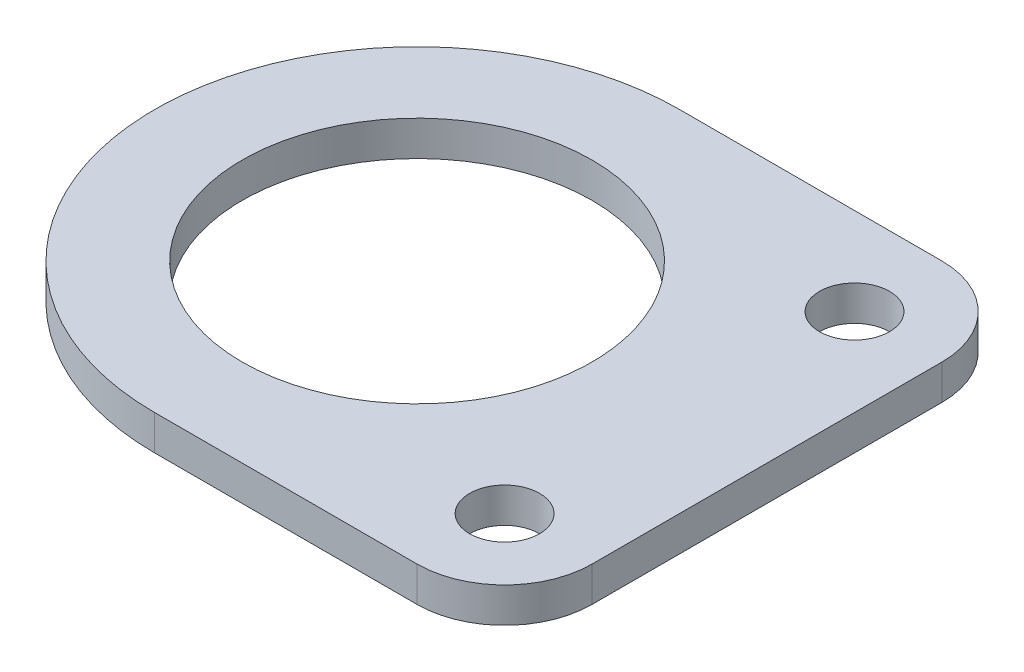
ISO-10303-21;
HEADER;
FILE_DESCRIPTION(('STEP AP214'),'2;1');
FILE_NAME('part.step','',(''),(''),'','','');
FILE_SCHEMA(('AUTOMOTIVE_DESIGN { 1 0 10303 214 1 1 1 1 }'));
ENDSEC;
DATA;
#1=APPLICATION_CONTEXT('core data for automotive mechanical design processes');
#2=APPLICATION_PROTOCOL_DEFINITION('international standard','automotive_design',2000,#1);
#3=PRODUCT_CONTEXT('',#1,'mechanical');
#4=PRODUCT('Part','Part','',(#3));
#5=PRODUCT_RELATED_PRODUCT_CATEGORY('part','',(#4));
#6=PRODUCT_DEFINITION_FORMATION('','',#4);
#7=PRODUCT_DEFINITION_CONTEXT('part definition',#1,'design');
#8=PRODUCT_DEFINITION('design','',#6,#7);
#9=PRODUCT_DEFINITION_SHAPE('','',#8);
#10=(LENGTH_UNIT() NAMED_UNIT(*) SI_UNIT(.MILLI.,.METRE.));
#11=(NAMED_UNIT(*) PLANE_ANGLE_UNIT() SI_UNIT($,.RADIAN.));
#12=(NAMED_UNIT(*) SI_UNIT($,.STERADIAN.) SOLID_ANGLE_UNIT());
#13=UNCERTAINTY_MEASURE_WITH_UNIT(LENGTH_MEASURE(1.E-05),#10,'distance_accuracy_value','');
#14=(GEOMETRIC_REPRESENTATION_CONTEXT(3) GLOBAL_UNCERTAINTY_ASSIGNED_CONTEXT((#13)) GLOBAL_UNIT_ASSIGNED_CONTEXT((#10,
#11,#12)) REPRESENTATION_CONTEXT('',''));
#15=CARTESIAN_POINT('',(0.,0.,0.));
#16=DIRECTION('',(0.,0.,1.));
#17=DIRECTION('',(1.,0.,0.));
#18=AXIS2_PLACEMENT_3D('',#15,#16,#17);
#19=CARTESIAN_POINT('',(0.,45.8673098247866,0.));
#20=DIRECTION('',(0.,1.,0.));
#21=DIRECTION('',(0.,0.,1.));
#22=AXIS2_PLACEMENT_3D('',#19,#20,#21);
#23=CYLINDRICAL_SURFACE('',#22,9.99999999999999);
#24=CARTESIAN_POINT('',(0.,0.,0.));
#25=DIRECTION('',(0.,1.,0.));
#26=DIRECTION('',(0.,0.,1.));
#27=AXIS2_PLACEMENT_3D('',#24,#25,#26);
#28=CIRCLE('',#27,9.99999999999999);
#29=CARTESIAN_POINT('',(0.,0.,9.99999999999999));
#30=VERTEX_POINT('',#29);
#31=EDGE_CURVE('E12',#30,#30,#28,.T.);
#32=ORIENTED_EDGE('',*,*,#31,.F.);
#33=EDGE_LOOP('',(#32));
#34=FACE_BOUND('',#33,.T.);
#35=CARTESIAN_POINT('',(0.,2.00000000000002,0.));
#36=DIRECTION('',(0.,1.,0.));
#37=DIRECTION('',(0.,0.,1.));
#38=AXIS2_PLACEMENT_3D('',#35,#36,#37);
#39=CIRCLE('',#38,9.99999999999999);
#40=CARTESIAN_POINT('',(0.,2.00000000000002,9.99999999999999));
#41=VERTEX_POINT('',#40);
#42=EDGE_CURVE('E178',#41,#41,#39,.T.);
#43=ORIENTED_EDGE('',*,*,#42,.T.);
#44=EDGE_LOOP('',(#43));
#45=FACE_BOUND('',#44,.T.);
#46=ADVANCED_FACE('F44',(#34,#45),#23,.F.);
#47=CARTESIAN_POINT('',(-9.99999999999999,0.,0.));
#48=DIRECTION('',(0.,-1.,0.));
#49=DIRECTION('',(0.,0.,-1.));
#50=AXIS2_PLACEMENT_3D('',#47,#48,#49);
#51=PLANE('',#50);
#52=CARTESIAN_POINT('',(15.,0.,9.99999999999996));
#53=DIRECTION('',(0.,-1.,0.));
#54=DIRECTION('',(0.,0.,-1.));
#55=AXIS2_PLACEMENT_3D('',#52,#53,#54);
#56=CIRCLE('',#55,2.);
#57=CARTESIAN_POINT('',(15.,0.,7.99999999999996));
#58=VERTEX_POINT('',#57);
#59=EDGE_CURVE('E187',#58,#58,#56,.T.);
#60=ORIENTED_EDGE('',*,*,#59,.F.);
#61=EDGE_LOOP('',(#60));
#62=FACE_BOUND('',#61,.T.);
#63=CARTESIAN_POINT('',(15.,0.,-9.99999999999996));
#64=DIRECTION('',(0.,-1.,0.));
#65=DIRECTION('',(0.,0.,-1.));
#66=AXIS2_PLACEMENT_3D('',#63,#64,#65);
#67=CIRCLE('',#66,2.);
#68=CARTESIAN_POINT('',(15.,0.,-12.));
#69=VERTEX_POINT('',#68);
#70=EDGE_CURVE('E179',#69,#69,#67,.T.);
#71=ORIENTED_EDGE('',*,*,#70,.F.);
#72=EDGE_LOOP('',(#71));
#73=FACE_BOUND('',#72,.T.);
#74=ORIENTED_EDGE('',*,*,#31,.T.);
#75=EDGE_LOOP('',(#74));
#76=FACE_BOUND('',#75,.T.);
#77=CARTESIAN_POINT('',(0.,0.,0.));
#78=DIRECTION('',(0.,1.,0.));
#79=DIRECTION('',(0.,0.,1.));
#80=AXIS2_PLACEMENT_3D('',#77,#78,#79);
#81=CIRCLE('',#80,15.);
#82=CARTESIAN_POINT('',(0.,0.,-15.));
#83=VERTEX_POINT('',#82);
#84=CARTESIAN_POINT('',(0.,0.,15.));
#85=VERTEX_POINT('',#84);
#86=EDGE_CURVE('E51',#83,#85,#81,.T.);
#87=ORIENTED_EDGE('',*,*,#86,.F.);
#88=DIRECTION('',(1.,0.,0.));
#89=VECTOR('',#88,1.);
#90=CARTESIAN_POINT('',(0.,0.,-15.));
#91=LINE('',#90,#89);
#92=CARTESIAN_POINT('',(15.,0.,-15.));
#93=VERTEX_POINT('',#92);
#94=EDGE_CURVE('E131',#83,#93,#91,.T.);
#95=ORIENTED_EDGE('',*,*,#94,.T.);
#96=CARTESIAN_POINT('',(15.,0.,-10.));
#97=DIRECTION('',(0.,-1.,0.));
#98=DIRECTION('',(0.,0.,-1.));
#99=AXIS2_PLACEMENT_3D('',#96,#97,#98);
#100=CIRCLE('',#99,5.);
#101=CARTESIAN_POINT('',(20.,0.,-10.));
#102=VERTEX_POINT('',#101);
#103=EDGE_CURVE('E134',#93,#102,#100,.T.);
#104=ORIENTED_EDGE('',*,*,#103,.T.);
#105=DIRECTION('',(0.,0.,1.));
#106=VECTOR('',#105,1.);
#107=CARTESIAN_POINT('',(20.,0.,-10.));
#108=LINE('',#107,#106);
#109=CARTESIAN_POINT('',(20.,0.,10.));
#110=VERTEX_POINT('',#109);
#111=EDGE_CURVE('E138',#102,#110,#108,.T.);
#112=ORIENTED_EDGE('',*,*,#111,.T.);
#113=CARTESIAN_POINT('',(15.,0.,10.));
#114=DIRECTION('',(0.,-1.,0.));
#115=DIRECTION('',(0.,0.,-1.));
#116=AXIS2_PLACEMENT_3D('',#113,#114,#115);
#117=CIRCLE('',#116,5.);
#118=CARTESIAN_POINT('',(15.,0.,15.));
#119=VERTEX_POINT('',#118);
#120=EDGE_CURVE('E110',#110,#119,#117,.T.);
#121=ORIENTED_EDGE('',*,*,#120,.T.);
#122=DIRECTION('',(-1.,0.,0.));
#123=VECTOR('',#122,1.);
#124=CARTESIAN_POINT('',(15.,0.,15.));
#125=LINE('',#124,#123);
#126=EDGE_CURVE('E141',#119,#85,#125,.T.);
#127=ORIENTED_EDGE('',*,*,#126,.T.);
#128=EDGE_LOOP('',(#87,#95,#104,#112,#121,#127));
#129=FACE_BOUND('',#128,.T.);
#130=ADVANCED_FACE('F156',(#62,#73,#76,#129),#51,.T.);
#131=CARTESIAN_POINT('',(0.,45.8673098247866,0.));
#132=DIRECTION('',(0.,1.,0.));
#133=DIRECTION('',(0.,0.,1.));
#134=AXIS2_PLACEMENT_3D('',#131,#132,#133);
#135=CYLINDRICAL_SURFACE('',#134,15.);
#136=DIRECTION('',(0.,-1.,0.));
#137=VECTOR('',#136,1.);
#138=CARTESIAN_POINT('',(0.,2.,15.));
#139=LINE('',#138,#137);
#140=CARTESIAN_POINT('',(0.,2.,15.));
#141=VERTEX_POINT('',#140);
#142=EDGE_CURVE('E90',#141,#85,#139,.T.);
#143=ORIENTED_EDGE('',*,*,#142,.F.);
#144=CARTESIAN_POINT('',(0.,2.00000000000001,0.));
#145=DIRECTION('',(0.,1.,0.));
#146=DIRECTION('',(0.,0.,1.));
#147=AXIS2_PLACEMENT_3D('',#144,#145,#146);
#148=CIRCLE('',#147,15.);
#149=CARTESIAN_POINT('',(0.,2.00000000000001,-15.));
#150=VERTEX_POINT('',#149);
#151=EDGE_CURVE('E144',#150,#141,#148,.T.);
#152=ORIENTED_EDGE('',*,*,#151,.F.);
#153=DIRECTION('',(0.,-1.,0.));
#154=VECTOR('',#153,1.);
#155=CARTESIAN_POINT('',(0.,2.,-15.));
#156=LINE('',#155,#154);
#157=EDGE_CURVE('E130',#150,#83,#156,.T.);
#158=ORIENTED_EDGE('',*,*,#157,.T.);
#159=ORIENTED_EDGE('',*,*,#86,.T.);
#160=EDGE_LOOP('',(#143,#152,#158,#159));
#161=FACE_BOUND('',#160,.T.);
#162=ADVANCED_FACE('F153',(#161),#135,.T.);
#163=CARTESIAN_POINT('',(-15.,2.00000000000001,0.));
#164=DIRECTION('',(0.,1.,0.));
#165=DIRECTION('',(0.,0.,1.));
#166=AXIS2_PLACEMENT_3D('',#163,#164,#165);
#167=PLANE('',#166);
#168=CARTESIAN_POINT('',(15.,2.,9.99999999999996));
#169=DIRECTION('',(0.,-1.,0.));
#170=DIRECTION('',(0.,0.,-1.));
#171=AXIS2_PLACEMENT_3D('',#168,#169,#170);
#172=CIRCLE('',#171,2.);
#173=CARTESIAN_POINT('',(15.,2.,7.99999999999996));
#174=VERTEX_POINT('',#173);
#175=EDGE_CURVE('E135',#174,#174,#172,.T.);
#176=ORIENTED_EDGE('',*,*,#175,.T.);
#177=EDGE_LOOP('',(#176));
#178=FACE_BOUND('',#177,.T.);
#179=CARTESIAN_POINT('',(15.,2.,-9.99999999999996));
#180=DIRECTION('',(0.,-1.,0.));
#181=DIRECTION('',(0.,0.,-1.));
#182=AXIS2_PLACEMENT_3D('',#179,#180,#181);
#183=CIRCLE('',#182,2.);
#184=CARTESIAN_POINT('',(15.,2.,-12.));
#185=VERTEX_POINT('',#184);
#186=EDGE_CURVE('E182',#185,#185,#183,.T.);
#187=ORIENTED_EDGE('',*,*,#186,.T.);
#188=EDGE_LOOP('',(#187));
#189=FACE_BOUND('',#188,.T.);
#190=ORIENTED_EDGE('',*,*,#151,.T.);
#191=DIRECTION('',(-1.,0.,0.));
#192=VECTOR('',#191,1.);
#193=CARTESIAN_POINT('',(15.,2.,15.));
#194=LINE('',#193,#192);
#195=CARTESIAN_POINT('',(15.,2.,15.));
#196=VERTEX_POINT('',#195);
#197=EDGE_CURVE('E67',#196,#141,#194,.T.);
#198=ORIENTED_EDGE('',*,*,#197,.F.);
#199=CARTESIAN_POINT('',(15.,2.,10.));
#200=DIRECTION('',(0.,-1.,0.));
#201=DIRECTION('',(0.,0.,-1.));
#202=AXIS2_PLACEMENT_3D('',#199,#200,#201);
#203=CIRCLE('',#202,5.);
#204=CARTESIAN_POINT('',(20.,2.,10.));
#205=VERTEX_POINT('',#204);
#206=EDGE_CURVE('E108',#205,#196,#203,.T.);
#207=ORIENTED_EDGE('',*,*,#206,.F.);
#208=DIRECTION('',(0.,0.,1.));
#209=VECTOR('',#208,1.);
#210=CARTESIAN_POINT('',(20.,2.,-10.));
#211=LINE('',#210,#209);
#212=CARTESIAN_POINT('',(20.,2.,-10.));
#213=VERTEX_POINT('',#212);
#214=EDGE_CURVE('E121',#213,#205,#211,.T.);
#215=ORIENTED_EDGE('',*,*,#214,.F.);
#216=CARTESIAN_POINT('',(15.,2.,-10.));
#217=DIRECTION('',(0.,-1.,0.));
#218=DIRECTION('',(0.,0.,-1.));
#219=AXIS2_PLACEMENT_3D('',#216,#217,#218);
#220=CIRCLE('',#219,5.);
#221=CARTESIAN_POINT('',(15.,2.,-15.));
#222=VERTEX_POINT('',#221);
#223=EDGE_CURVE('E124',#222,#213,#220,.T.);
#224=ORIENTED_EDGE('',*,*,#223,.F.);
#225=DIRECTION('',(1.,0.,0.));
#226=VECTOR('',#225,1.);
#227=CARTESIAN_POINT('',(0.,2.,-15.));
#228=LINE('',#227,#226);
#229=EDGE_CURVE('E58',#150,#222,#228,.T.);
#230=ORIENTED_EDGE('',*,*,#229,.F.);
#231=EDGE_LOOP('',(#190,#198,#207,#215,#224,#230));
#232=FACE_BOUND('',#231,.T.);
#233=ORIENTED_EDGE('',*,*,#42,.F.);
#234=EDGE_LOOP('',(#233));
#235=FACE_BOUND('',#234,.T.);
#236=ADVANCED_FACE('F119',(#178,#189,#232,#235),#167,.T.);
#237=CARTESIAN_POINT('',(15.,2.,15.));
#238=DIRECTION('',(0.,0.,1.));
#239=DIRECTION('',(1.,0.,0.));
#240=AXIS2_PLACEMENT_3D('',#237,#238,#239);
#241=PLANE('',#240);
#242=ORIENTED_EDGE('',*,*,#126,.F.);
#243=DIRECTION('',(0.,-1.,0.));
#244=VECTOR('',#243,1.);
#245=CARTESIAN_POINT('',(15.,2.,15.));
#246=LINE('',#245,#244);
#247=EDGE_CURVE('E115',#196,#119,#246,.T.);
#248=ORIENTED_EDGE('',*,*,#247,.F.);
#249=ORIENTED_EDGE('',*,*,#197,.T.);
#250=ORIENTED_EDGE('',*,*,#142,.T.);
#251=EDGE_LOOP('',(#242,#248,#249,#250));
#252=FACE_BOUND('',#251,.T.);
#253=ADVANCED_FACE('F157',(#252),#241,.T.);
#254=CARTESIAN_POINT('',(15.,2.,10.));
#255=DIRECTION('',(0.,-1.,0.));
#256=DIRECTION('',(0.,0.,-1.));
#257=AXIS2_PLACEMENT_3D('',#254,#255,#256);
#258=CYLINDRICAL_SURFACE('',#257,5.);
#259=ORIENTED_EDGE('',*,*,#120,.F.);
#260=DIRECTION('',(0.,-1.,0.));
#261=VECTOR('',#260,1.);
#262=CARTESIAN_POINT('',(20.,2.,10.));
#263=LINE('',#262,#261);
#264=EDGE_CURVE('E105',#205,#110,#263,.T.);
#265=ORIENTED_EDGE('',*,*,#264,.F.);
#266=ORIENTED_EDGE('',*,*,#206,.T.);
#267=ORIENTED_EDGE('',*,*,#247,.T.);
#268=EDGE_LOOP('',(#259,#265,#266,#267));
#269=FACE_BOUND('',#268,.T.);
#270=ADVANCED_FACE('F107',(#269),#258,.T.);
#271=CARTESIAN_POINT('',(20.,2.,-10.));
#272=DIRECTION('',(1.,0.,0.));
#273=DIRECTION('',(0.,0.,-1.));
#274=AXIS2_PLACEMENT_3D('',#271,#272,#273);
#275=PLANE('',#274);
#276=ORIENTED_EDGE('',*,*,#111,.F.);
#277=DIRECTION('',(0.,-1.,0.));
#278=VECTOR('',#277,1.);
#279=CARTESIAN_POINT('',(20.,2.,-10.));
#280=LINE('',#279,#278);
#281=EDGE_CURVE('E116',#213,#102,#280,.T.);
#282=ORIENTED_EDGE('',*,*,#281,.F.);
#283=ORIENTED_EDGE('',*,*,#214,.T.);
#284=ORIENTED_EDGE('',*,*,#264,.T.);
#285=EDGE_LOOP('',(#276,#282,#283,#284));
#286=FACE_BOUND('',#285,.T.);
#287=ADVANCED_FACE('F123',(#286),#275,.T.);
#288=CARTESIAN_POINT('',(15.,2.,-10.));
#289=DIRECTION('',(0.,-1.,0.));
#290=DIRECTION('',(0.,0.,-1.));
#291=AXIS2_PLACEMENT_3D('',#288,#289,#290);
#292=CYLINDRICAL_SURFACE('',#291,5.);
#293=ORIENTED_EDGE('',*,*,#103,.F.);
#294=DIRECTION('',(0.,-1.,0.));
#295=VECTOR('',#294,1.);
#296=CARTESIAN_POINT('',(15.,2.,-15.));
#297=LINE('',#296,#295);
#298=EDGE_CURVE('E98',#222,#93,#297,.T.);
#299=ORIENTED_EDGE('',*,*,#298,.F.);
#300=ORIENTED_EDGE('',*,*,#223,.T.);
#301=ORIENTED_EDGE('',*,*,#281,.T.);
#302=EDGE_LOOP('',(#293,#299,#300,#301));
#303=FACE_BOUND('',#302,.T.);
#304=ADVANCED_FACE('F193',(#303),#292,.T.);
#305=CARTESIAN_POINT('',(0.,2.,-15.));
#306=DIRECTION('',(0.,0.,-1.));
#307=DIRECTION('',(-1.,0.,0.));
#308=AXIS2_PLACEMENT_3D('',#305,#306,#307);
#309=PLANE('',#308);
#310=ORIENTED_EDGE('',*,*,#94,.F.);
#311=ORIENTED_EDGE('',*,*,#157,.F.);
#312=ORIENTED_EDGE('',*,*,#229,.T.);
#313=ORIENTED_EDGE('',*,*,#298,.T.);
#314=EDGE_LOOP('',(#310,#311,#312,#313));
#315=FACE_BOUND('',#314,.T.);
#316=ADVANCED_FACE('F192',(#315),#309,.T.);
#317=CARTESIAN_POINT('',(15.,2.,-9.99999999999996));
#318=DIRECTION('',(0.,-1.,0.));
#319=DIRECTION('',(0.,0.,-1.));
#320=AXIS2_PLACEMENT_3D('',#317,#318,#319);
#321=CYLINDRICAL_SURFACE('',#320,2.);
#322=ORIENTED_EDGE('',*,*,#186,.F.);
#323=EDGE_LOOP('',(#322));
#324=FACE_BOUND('',#323,.T.);
#325=ORIENTED_EDGE('',*,*,#70,.T.);
#326=EDGE_LOOP('',(#325));
#327=FACE_BOUND('',#326,.T.);
#328=ADVANCED_FACE('F200',(#324,#327),#321,.F.);
#329=CARTESIAN_POINT('',(15.,2.,9.99999999999996));
#330=DIRECTION('',(0.,-1.,0.));
#331=DIRECTION('',(0.,0.,-1.));
#332=AXIS2_PLACEMENT_3D('',#329,#330,#331);
#333=CYLINDRICAL_SURFACE('',#332,2.);
#334=ORIENTED_EDGE('',*,*,#175,.F.);
#335=EDGE_LOOP('',(#334));
#336=FACE_BOUND('',#335,.T.);
#337=ORIENTED_EDGE('',*,*,#59,.T.);
#338=EDGE_LOOP('',(#337));
#339=FACE_BOUND('',#338,.T.);
#340=ADVANCED_FACE('F224',(#336,#339),#333,.F.);
#341=CLOSED_SHELL('',(#46,#130,#162,#236,#253,#270,#287,#304,#316,#328,#340));
#342=MANIFOLD_SOLID_BREP('B2',#341);
#343=ADVANCED_BREP_SHAPE_REPRESENTATION('',(#18,#342),#14);
#344=SHAPE_DEFINITION_REPRESENTATION(#9,#343);
ENDSEC;
END-ISO-10303-21;
